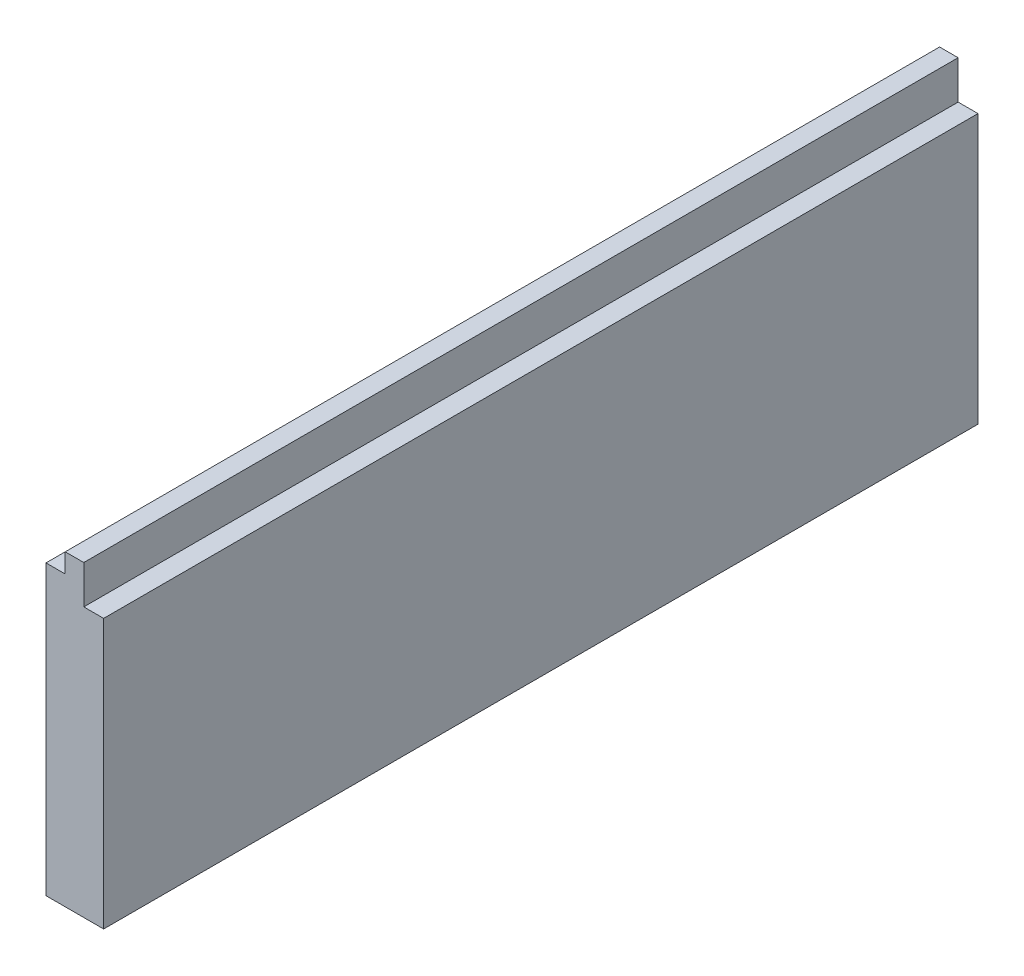
ISO-10303-21;
HEADER;
FILE_DESCRIPTION(('STEP AP214'),'2;1');
FILE_NAME('part.step','',(''),(''),'','','');
FILE_SCHEMA(('AUTOMOTIVE_DESIGN { 1 0 10303 214 1 1 1 1 }'));
ENDSEC;
DATA;
#1=APPLICATION_CONTEXT('core data for automotive mechanical design processes');
#2=APPLICATION_PROTOCOL_DEFINITION('international standard','automotive_design',2000,#1);
#3=PRODUCT_CONTEXT('',#1,'mechanical');
#4=PRODUCT('Part','Part','',(#3));
#5=PRODUCT_RELATED_PRODUCT_CATEGORY('part','',(#4));
#6=PRODUCT_DEFINITION_FORMATION('','',#4);
#7=PRODUCT_DEFINITION_CONTEXT('part definition',#1,'design');
#8=PRODUCT_DEFINITION('design','',#6,#7);
#9=PRODUCT_DEFINITION_SHAPE('','',#8);
#10=(LENGTH_UNIT() NAMED_UNIT(*) SI_UNIT(.MILLI.,.METRE.));
#11=(NAMED_UNIT(*) PLANE_ANGLE_UNIT() SI_UNIT($,.RADIAN.));
#12=(NAMED_UNIT(*) SI_UNIT($,.STERADIAN.) SOLID_ANGLE_UNIT());
#13=UNCERTAINTY_MEASURE_WITH_UNIT(LENGTH_MEASURE(1.E-05),#10,'distance_accuracy_value','');
#14=(GEOMETRIC_REPRESENTATION_CONTEXT(3) GLOBAL_UNCERTAINTY_ASSIGNED_CONTEXT((#13)) GLOBAL_UNIT_ASSIGNED_CONTEXT((#10,
#11,#12)) REPRESENTATION_CONTEXT('',''));
#15=CARTESIAN_POINT('',(0.,0.,0.));
#16=DIRECTION('',(0.,0.,1.));
#17=DIRECTION('',(1.,0.,0.));
#18=AXIS2_PLACEMENT_3D('',#15,#16,#17);
#19=CARTESIAN_POINT('',(0.,150.,455.));
#20=DIRECTION('',(1.,0.,0.));
#21=DIRECTION('',(0.,1.,0.));
#22=AXIS2_PLACEMENT_3D('',#19,#20,#21);
#23=PLANE('',#22);
#24=DIRECTION('',(0.,-1.,0.));
#25=VECTOR('',#24,1.);
#26=CARTESIAN_POINT('',(0.,150.,0.));
#27=LINE('',#26,#25);
#28=CARTESIAN_POINT('',(0.,150.,0.));
#29=VERTEX_POINT('',#28);
#30=CARTESIAN_POINT('',(0.,0.,0.));
#31=VERTEX_POINT('',#30);
#32=EDGE_CURVE('E131',#29,#31,#27,.T.);
#33=ORIENTED_EDGE('',*,*,#32,.T.);
#34=DIRECTION('',(0.,0.,-1.));
#35=VECTOR('',#34,1.);
#36=CARTESIAN_POINT('',(0.,0.,455.));
#37=LINE('',#36,#35);
#38=CARTESIAN_POINT('',(0.,0.,455.));
#39=VERTEX_POINT('',#38);
#40=EDGE_CURVE('E11',#39,#31,#37,.T.);
#41=ORIENTED_EDGE('',*,*,#40,.F.);
#42=DIRECTION('',(0.,-1.,0.));
#43=VECTOR('',#42,1.);
#44=CARTESIAN_POINT('',(0.,150.,455.));
#45=LINE('',#44,#43);
#46=CARTESIAN_POINT('',(0.,150.,455.));
#47=VERTEX_POINT('',#46);
#48=EDGE_CURVE('E145',#47,#39,#45,.T.);
#49=ORIENTED_EDGE('',*,*,#48,.F.);
#50=DIRECTION('',(0.,0.,-1.));
#51=VECTOR('',#50,1.);
#52=CARTESIAN_POINT('',(0.,150.,455.));
#53=LINE('',#52,#51);
#54=EDGE_CURVE('E127',#47,#29,#53,.T.);
#55=ORIENTED_EDGE('',*,*,#54,.T.);
#56=EDGE_LOOP('',(#33,#41,#49,#55));
#57=FACE_BOUND('',#56,.T.);
#58=ADVANCED_FACE('F35',(#57),#23,.F.);
#59=CARTESIAN_POINT('',(10.,0.,455.));
#60=DIRECTION('',(0.,1.,0.));
#61=DIRECTION('',(0.,0.,1.));
#62=AXIS2_PLACEMENT_3D('',#59,#60,#61);
#63=PLANE('',#62);
#64=DIRECTION('',(1.,0.,0.));
#65=VECTOR('',#64,1.);
#66=CARTESIAN_POINT('',(10.,0.,0.));
#67=LINE('',#66,#65);
#68=CARTESIAN_POINT('',(30.,0.,0.));
#69=VERTEX_POINT('',#68);
#70=EDGE_CURVE('E134',#31,#69,#67,.T.);
#71=ORIENTED_EDGE('',*,*,#70,.T.);
#72=DIRECTION('',(0.,0.,-1.));
#73=VECTOR('',#72,1.);
#74=CARTESIAN_POINT('',(30.,0.,455.));
#75=LINE('',#74,#73);
#76=CARTESIAN_POINT('',(30.,0.,455.));
#77=VERTEX_POINT('',#76);
#78=EDGE_CURVE('E43',#77,#69,#75,.T.);
#79=ORIENTED_EDGE('',*,*,#78,.F.);
#80=DIRECTION('',(1.,0.,0.));
#81=VECTOR('',#80,1.);
#82=CARTESIAN_POINT('',(0.,0.,455.));
#83=LINE('',#82,#81);
#84=EDGE_CURVE('E94',#39,#77,#83,.T.);
#85=ORIENTED_EDGE('',*,*,#84,.F.);
#86=ORIENTED_EDGE('',*,*,#40,.T.);
#87=EDGE_LOOP('',(#71,#79,#85,#86));
#88=FACE_BOUND('',#87,.T.);
#89=ADVANCED_FACE('F180',(#88),#63,.F.);
#90=CARTESIAN_POINT('',(30.,0.,455.));
#91=DIRECTION('',(-1.,0.,0.));
#92=DIRECTION('',(0.,-1.,0.));
#93=AXIS2_PLACEMENT_3D('',#90,#91,#92);
#94=PLANE('',#93);
#95=DIRECTION('',(0.,1.,0.));
#96=VECTOR('',#95,1.);
#97=CARTESIAN_POINT('',(30.,0.,0.));
#98=LINE('',#97,#96);
#99=CARTESIAN_POINT('',(30.,140.,0.));
#100=VERTEX_POINT('',#99);
#101=EDGE_CURVE('E136',#69,#100,#98,.T.);
#102=ORIENTED_EDGE('',*,*,#101,.T.);
#103=DIRECTION('',(0.,0.,-1.));
#104=VECTOR('',#103,1.);
#105=CARTESIAN_POINT('',(30.,140.,455.));
#106=LINE('',#105,#104);
#107=CARTESIAN_POINT('',(30.,140.,455.));
#108=VERTEX_POINT('',#107);
#109=EDGE_CURVE('E152',#108,#100,#106,.T.);
#110=ORIENTED_EDGE('',*,*,#109,.F.);
#111=DIRECTION('',(0.,1.,0.));
#112=VECTOR('',#111,1.);
#113=CARTESIAN_POINT('',(30.,0.,455.));
#114=LINE('',#113,#112);
#115=EDGE_CURVE('E160',#77,#108,#114,.T.);
#116=ORIENTED_EDGE('',*,*,#115,.F.);
#117=ORIENTED_EDGE('',*,*,#78,.T.);
#118=EDGE_LOOP('',(#102,#110,#116,#117));
#119=FACE_BOUND('',#118,.T.);
#120=ADVANCED_FACE('F158',(#119),#94,.F.);
#121=CARTESIAN_POINT('',(30.,140.,455.));
#122=DIRECTION('',(0.,-1.,0.));
#123=DIRECTION('',(0.,0.,-1.));
#124=AXIS2_PLACEMENT_3D('',#121,#122,#123);
#125=PLANE('',#124);
#126=DIRECTION('',(-1.,0.,0.));
#127=VECTOR('',#126,1.);
#128=CARTESIAN_POINT('',(30.,140.,0.));
#129=LINE('',#128,#127);
#130=CARTESIAN_POINT('',(19.6619478750926,140.,0.));
#131=VERTEX_POINT('',#130);
#132=EDGE_CURVE('E138',#100,#131,#129,.T.);
#133=ORIENTED_EDGE('',*,*,#132,.T.);
#134=DIRECTION('',(0.,0.,-1.));
#135=VECTOR('',#134,1.);
#136=CARTESIAN_POINT('',(19.6619478750926,140.,455.));
#137=LINE('',#136,#135);
#138=CARTESIAN_POINT('',(19.6619478750926,140.,455.));
#139=VERTEX_POINT('',#138);
#140=EDGE_CURVE('E149',#139,#131,#137,.T.);
#141=ORIENTED_EDGE('',*,*,#140,.F.);
#142=DIRECTION('',(-1.,0.,0.));
#143=VECTOR('',#142,1.);
#144=CARTESIAN_POINT('',(30.,140.,455.));
#145=LINE('',#144,#143);
#146=EDGE_CURVE('E172',#108,#139,#145,.T.);
#147=ORIENTED_EDGE('',*,*,#146,.F.);
#148=ORIENTED_EDGE('',*,*,#109,.T.);
#149=EDGE_LOOP('',(#133,#141,#147,#148));
#150=FACE_BOUND('',#149,.T.);
#151=ADVANCED_FACE('F168',(#150),#125,.F.);
#152=CARTESIAN_POINT('',(19.6619478750926,140.,455.));
#153=DIRECTION('',(-1.,0.,0.));
#154=DIRECTION('',(0.,-1.,0.));
#155=AXIS2_PLACEMENT_3D('',#152,#153,#154);
#156=PLANE('',#155);
#157=DIRECTION('',(0.,1.,0.));
#158=VECTOR('',#157,1.);
#159=CARTESIAN_POINT('',(19.6619478750926,140.,0.));
#160=LINE('',#159,#158);
#161=CARTESIAN_POINT('',(19.6619478750926,160.,0.));
#162=VERTEX_POINT('',#161);
#163=EDGE_CURVE('E140',#131,#162,#160,.T.);
#164=ORIENTED_EDGE('',*,*,#163,.T.);
#165=DIRECTION('',(0.,0.,-1.));
#166=VECTOR('',#165,1.);
#167=CARTESIAN_POINT('',(19.6619478750926,160.,455.));
#168=LINE('',#167,#166);
#169=CARTESIAN_POINT('',(19.6619478750926,160.,455.));
#170=VERTEX_POINT('',#169);
#171=EDGE_CURVE('E122',#170,#162,#168,.T.);
#172=ORIENTED_EDGE('',*,*,#171,.F.);
#173=DIRECTION('',(0.,1.,0.));
#174=VECTOR('',#173,1.);
#175=CARTESIAN_POINT('',(19.6619478750926,140.,455.));
#176=LINE('',#175,#174);
#177=EDGE_CURVE('E113',#139,#170,#176,.T.);
#178=ORIENTED_EDGE('',*,*,#177,.F.);
#179=ORIENTED_EDGE('',*,*,#140,.T.);
#180=EDGE_LOOP('',(#164,#172,#178,#179));
#181=FACE_BOUND('',#180,.T.);
#182=ADVANCED_FACE('F171',(#181),#156,.F.);
#183=CARTESIAN_POINT('',(19.6619478750926,160.,455.));
#184=DIRECTION('',(0.,-1.,0.));
#185=DIRECTION('',(0.,0.,-1.));
#186=AXIS2_PLACEMENT_3D('',#183,#184,#185);
#187=PLANE('',#186);
#188=DIRECTION('',(-1.,0.,0.));
#189=VECTOR('',#188,1.);
#190=CARTESIAN_POINT('',(19.6619478750926,160.,0.));
#191=LINE('',#190,#189);
#192=CARTESIAN_POINT('',(10.,160.,0.));
#193=VERTEX_POINT('',#192);
#194=EDGE_CURVE('E121',#162,#193,#191,.T.);
#195=ORIENTED_EDGE('',*,*,#194,.T.);
#196=DIRECTION('',(0.,0.,-1.));
#197=VECTOR('',#196,1.);
#198=CARTESIAN_POINT('',(10.,160.,455.));
#199=LINE('',#198,#197);
#200=CARTESIAN_POINT('',(10.,160.,455.));
#201=VERTEX_POINT('',#200);
#202=EDGE_CURVE('E118',#201,#193,#199,.T.);
#203=ORIENTED_EDGE('',*,*,#202,.F.);
#204=DIRECTION('',(-1.,0.,0.));
#205=VECTOR('',#204,1.);
#206=CARTESIAN_POINT('',(19.6619478750926,160.,455.));
#207=LINE('',#206,#205);
#208=EDGE_CURVE('E107',#170,#201,#207,.T.);
#209=ORIENTED_EDGE('',*,*,#208,.F.);
#210=ORIENTED_EDGE('',*,*,#171,.T.);
#211=EDGE_LOOP('',(#195,#203,#209,#210));
#212=FACE_BOUND('',#211,.T.);
#213=ADVANCED_FACE('F119',(#212),#187,.F.);
#214=CARTESIAN_POINT('',(10.,160.,455.));
#215=DIRECTION('',(1.,0.,0.));
#216=DIRECTION('',(0.,1.,0.));
#217=AXIS2_PLACEMENT_3D('',#214,#215,#216);
#218=PLANE('',#217);
#219=DIRECTION('',(0.,-1.,0.));
#220=VECTOR('',#219,1.);
#221=CARTESIAN_POINT('',(10.,160.,0.));
#222=LINE('',#221,#220);
#223=CARTESIAN_POINT('',(10.,150.,0.));
#224=VERTEX_POINT('',#223);
#225=EDGE_CURVE('E80',#193,#224,#222,.T.);
#226=ORIENTED_EDGE('',*,*,#225,.T.);
#227=DIRECTION('',(0.,0.,-1.));
#228=VECTOR('',#227,1.);
#229=CARTESIAN_POINT('',(10.,150.,455.));
#230=LINE('',#229,#228);
#231=CARTESIAN_POINT('',(10.,150.,455.));
#232=VERTEX_POINT('',#231);
#233=EDGE_CURVE('E123',#232,#224,#230,.T.);
#234=ORIENTED_EDGE('',*,*,#233,.F.);
#235=DIRECTION('',(0.,-1.,0.));
#236=VECTOR('',#235,1.);
#237=CARTESIAN_POINT('',(10.,160.,455.));
#238=LINE('',#237,#236);
#239=EDGE_CURVE('E111',#201,#232,#238,.T.);
#240=ORIENTED_EDGE('',*,*,#239,.F.);
#241=ORIENTED_EDGE('',*,*,#202,.T.);
#242=EDGE_LOOP('',(#226,#234,#240,#241));
#243=FACE_BOUND('',#242,.T.);
#244=ADVANCED_FACE('F125',(#243),#218,.F.);
#245=CARTESIAN_POINT('',(10.,150.,455.));
#246=DIRECTION('',(0.,-1.,0.));
#247=DIRECTION('',(0.,0.,-1.));
#248=AXIS2_PLACEMENT_3D('',#245,#246,#247);
#249=PLANE('',#248);
#250=DIRECTION('',(-1.,0.,0.));
#251=VECTOR('',#250,1.);
#252=CARTESIAN_POINT('',(10.,150.,0.));
#253=LINE('',#252,#251);
#254=EDGE_CURVE('E86',#224,#29,#253,.T.);
#255=ORIENTED_EDGE('',*,*,#254,.T.);
#256=ORIENTED_EDGE('',*,*,#54,.F.);
#257=DIRECTION('',(-1.,0.,0.));
#258=VECTOR('',#257,1.);
#259=CARTESIAN_POINT('',(10.,150.,455.));
#260=LINE('',#259,#258);
#261=EDGE_CURVE('E51',#232,#47,#260,.T.);
#262=ORIENTED_EDGE('',*,*,#261,.F.);
#263=ORIENTED_EDGE('',*,*,#233,.T.);
#264=EDGE_LOOP('',(#255,#256,#262,#263));
#265=FACE_BOUND('',#264,.T.);
#266=ADVANCED_FACE('F196',(#265),#249,.F.);
#267=CARTESIAN_POINT('',(0.,0.,455.));
#268=DIRECTION('',(0.,0.,1.));
#269=DIRECTION('',(1.,0.,0.));
#270=AXIS2_PLACEMENT_3D('',#267,#268,#269);
#271=PLANE('',#270);
#272=ORIENTED_EDGE('',*,*,#48,.T.);
#273=ORIENTED_EDGE('',*,*,#84,.T.);
#274=ORIENTED_EDGE('',*,*,#115,.T.);
#275=ORIENTED_EDGE('',*,*,#146,.T.);
#276=ORIENTED_EDGE('',*,*,#177,.T.);
#277=ORIENTED_EDGE('',*,*,#208,.T.);
#278=ORIENTED_EDGE('',*,*,#239,.T.);
#279=ORIENTED_EDGE('',*,*,#261,.T.);
#280=EDGE_LOOP('',(#272,#273,#274,#275,#276,#277,#278,#279));
#281=FACE_BOUND('',#280,.T.);
#282=ADVANCED_FACE('F109',(#281),#271,.T.);
#283=CARTESIAN_POINT('',(0.,0.,0.));
#284=DIRECTION('',(0.,0.,1.));
#285=DIRECTION('',(1.,0.,0.));
#286=AXIS2_PLACEMENT_3D('',#283,#284,#285);
#287=PLANE('',#286);
#288=ORIENTED_EDGE('',*,*,#32,.F.);
#289=ORIENTED_EDGE('',*,*,#254,.F.);
#290=ORIENTED_EDGE('',*,*,#225,.F.);
#291=ORIENTED_EDGE('',*,*,#194,.F.);
#292=ORIENTED_EDGE('',*,*,#163,.F.);
#293=ORIENTED_EDGE('',*,*,#132,.F.);
#294=ORIENTED_EDGE('',*,*,#101,.F.);
#295=ORIENTED_EDGE('',*,*,#70,.F.);
#296=EDGE_LOOP('',(#288,#289,#290,#291,#292,#293,#294,#295));
#297=FACE_BOUND('',#296,.T.);
#298=ADVANCED_FACE('F164',(#297),#287,.F.);
#299=CLOSED_SHELL('',(#58,#89,#120,#151,#182,#213,#244,#266,#282,#298));
#300=MANIFOLD_SOLID_BREP('B2',#299);
#301=ADVANCED_BREP_SHAPE_REPRESENTATION('',(#18,#300),#14);
#302=SHAPE_DEFINITION_REPRESENTATION(#9,#301);
ENDSEC;
END-ISO-10303-21;
